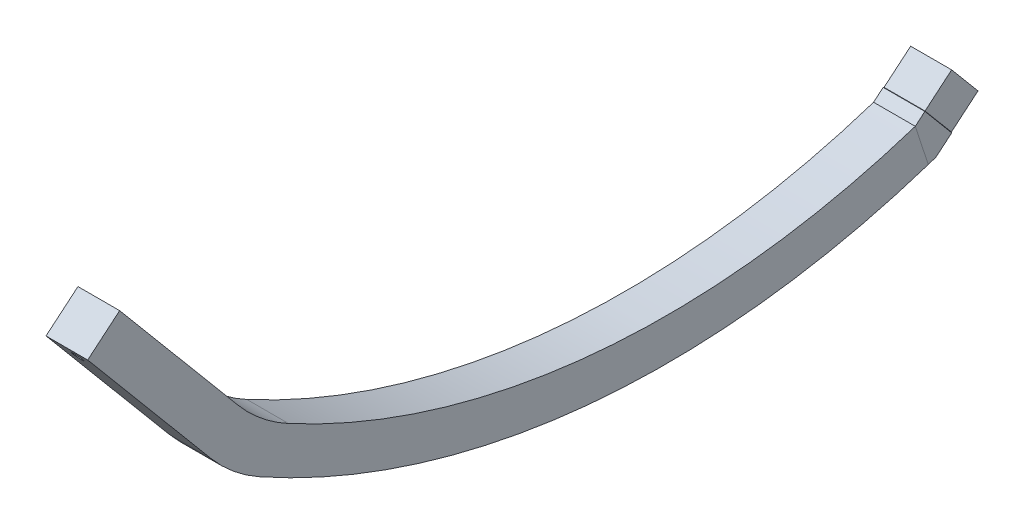
ISO-10303-21;
HEADER;
FILE_DESCRIPTION(('STEP AP214'),'2;1');
FILE_NAME('part.step','',(''),(''),'','','');
FILE_SCHEMA(('AUTOMOTIVE_DESIGN { 1 0 10303 214 1 1 1 1 }'));
ENDSEC;
DATA;
#1=APPLICATION_CONTEXT('core data for automotive mechanical design processes');
#2=APPLICATION_PROTOCOL_DEFINITION('international standard','automotive_design',2000,#1);
#3=PRODUCT_CONTEXT('',#1,'mechanical');
#4=PRODUCT('Part','Part','',(#3));
#5=PRODUCT_RELATED_PRODUCT_CATEGORY('part','',(#4));
#6=PRODUCT_DEFINITION_FORMATION('','',#4);
#7=PRODUCT_DEFINITION_CONTEXT('part definition',#1,'design');
#8=PRODUCT_DEFINITION('design','',#6,#7);
#9=PRODUCT_DEFINITION_SHAPE('','',#8);
#10=(LENGTH_UNIT() NAMED_UNIT(*) SI_UNIT(.MILLI.,.METRE.));
#11=(NAMED_UNIT(*) PLANE_ANGLE_UNIT() SI_UNIT($,.RADIAN.));
#12=(NAMED_UNIT(*) SI_UNIT($,.STERADIAN.) SOLID_ANGLE_UNIT());
#13=UNCERTAINTY_MEASURE_WITH_UNIT(LENGTH_MEASURE(1.E-05),#10,'distance_accuracy_value','');
#14=(GEOMETRIC_REPRESENTATION_CONTEXT(3) GLOBAL_UNCERTAINTY_ASSIGNED_CONTEXT((#13)) GLOBAL_UNIT_ASSIGNED_CONTEXT((#10,
#11,#12)) REPRESENTATION_CONTEXT('',''));
#15=CARTESIAN_POINT('',(0.,0.,0.));
#16=DIRECTION('',(0.,0.,1.));
#17=DIRECTION('',(1.,0.,0.));
#18=AXIS2_PLACEMENT_3D('',#15,#16,#17);
#19=CARTESIAN_POINT('',(12.,23.0257511275811,-14.4824825913771));
#20=DIRECTION('',(0.,0.766044443118982,0.642787609686534));
#21=DIRECTION('',(0.,-0.642787609686534,0.766044443118982));
#22=AXIS2_PLACEMENT_3D('',#19,#20,#21);
#23=PLANE('',#22);
#24=DIRECTION('',(0.,0.642787609686534,-0.766044443118982));
#25=VECTOR('',#24,1.);
#26=CARTESIAN_POINT('',(0.,23.0257511275811,-14.4824825913771));
#27=LINE('',#26,#25);
#28=CARTESIAN_POINT('',(0.,12.7411493725965,-2.22577150147341));
#29=VERTEX_POINT('',#28);
#30=CARTESIAN_POINT('',(0.,16.5335962697471,-6.7454337158754));
#31=VERTEX_POINT('',#30);
#32=EDGE_CURVE('E190',#29,#31,#27,.T.);
#33=ORIENTED_EDGE('',*,*,#32,.T.);
#34=DIRECTION('',(1.,0.,0.));
#35=VECTOR('',#34,1.);
#36=CARTESIAN_POINT('',(12.,16.5335962697471,-6.7454337158754));
#37=LINE('',#36,#35);
#38=CARTESIAN_POINT('',(12.,16.533596269747,-6.74543371587538));
#39=VERTEX_POINT('',#38);
#40=EDGE_CURVE('E69',#31,#39,#37,.T.);
#41=ORIENTED_EDGE('',*,*,#40,.T.);
#42=DIRECTION('',(0.,0.642787609686534,-0.766044443118982));
#43=VECTOR('',#42,1.);
#44=CARTESIAN_POINT('',(12.,23.0257511275811,-14.4824825913771));
#45=LINE('',#44,#43);
#46=CARTESIAN_POINT('',(12.,12.7411493725965,-2.22577150147341));
#47=VERTEX_POINT('',#46);
#48=EDGE_CURVE('E181',#47,#39,#45,.T.);
#49=ORIENTED_EDGE('',*,*,#48,.F.);
#50=DIRECTION('',(-1.,0.,0.));
#51=VECTOR('',#50,1.);
#52=CARTESIAN_POINT('',(12.,12.7411493725965,-2.22577150147341));
#53=LINE('',#52,#51);
#54=EDGE_CURVE('E195',#47,#29,#53,.T.);
#55=ORIENTED_EDGE('',*,*,#54,.T.);
#56=EDGE_LOOP('',(#33,#41,#49,#55));
#57=FACE_BOUND('',#56,.T.);
#58=ADVANCED_FACE('F45',(#57),#23,.F.);
#59=CARTESIAN_POINT('',(12.,23.403668611832,3.73581881138778));
#60=DIRECTION('',(0.,-0.766044443118981,-0.642787609686535));
#61=DIRECTION('',(0.,0.642787609686535,-0.766044443118982));
#62=AXIS2_PLACEMENT_3D('',#59,#60,#61);
#63=PLANE('',#62);
#64=DIRECTION('',(0.,-0.642787609686535,0.766044443118982));
#65=VECTOR('',#64,1.);
#66=CARTESIAN_POINT('',(12.,23.403668611832,3.73581881138778));
#67=LINE('',#66,#65);
#68=CARTESIAN_POINT('',(12.,25.7261295871748,0.968017600363012));
#69=VERTEX_POINT('',#68);
#70=CARTESIAN_POINT('',(12.,23.403668611832,3.73581881138778));
#71=VERTEX_POINT('',#70);
#72=EDGE_CURVE('E183',#69,#71,#67,.T.);
#73=ORIENTED_EDGE('',*,*,#72,.F.);
#74=DIRECTION('',(-1.,0.,0.));
#75=VECTOR('',#74,1.);
#76=CARTESIAN_POINT('',(0.,25.7261295871748,0.968017600363013));
#77=LINE('',#76,#75);
#78=CARTESIAN_POINT('',(0.,25.7261295871748,0.968017600363012));
#79=VERTEX_POINT('',#78);
#80=EDGE_CURVE('E12',#69,#79,#77,.T.);
#81=ORIENTED_EDGE('',*,*,#80,.T.);
#82=DIRECTION('',(0.,-0.642787609686535,0.766044443118982));
#83=VECTOR('',#82,1.);
#84=CARTESIAN_POINT('',(0.,23.403668611832,3.73581881138778));
#85=LINE('',#84,#83);
#86=CARTESIAN_POINT('',(0.,23.403668611832,3.73581881138778));
#87=VERTEX_POINT('',#86);
#88=EDGE_CURVE('E179',#79,#87,#85,.T.);
#89=ORIENTED_EDGE('',*,*,#88,.T.);
#90=DIRECTION('',(-1.,0.,0.));
#91=VECTOR('',#90,1.);
#92=CARTESIAN_POINT('',(12.,23.403668611832,3.73581881138778));
#93=LINE('',#92,#91);
#94=EDGE_CURVE('E185',#71,#87,#93,.T.);
#95=ORIENTED_EDGE('',*,*,#94,.F.);
#96=EDGE_LOOP('',(#73,#81,#89,#95));
#97=FACE_BOUND('',#96,.T.);
#98=ADVANCED_FACE('F213',(#97),#63,.F.);
#99=CARTESIAN_POINT('',(12.,241.476472406345,75.1760290102655));
#100=DIRECTION('',(1.,0.,0.));
#101=DIRECTION('',(0.,0.,-1.));
#102=AXIS2_PLACEMENT_3D('',#99,#100,#101);
#103=PLANE('',#102);
#104=ORIENTED_EDGE('',*,*,#48,.T.);
#105=DIRECTION('',(0.,0.766044443118981,0.642787609686535));
#106=VECTOR('',#105,1.);
#107=CARTESIAN_POINT('',(12.,188.873940413588,137.865285492186));
#108=LINE('',#107,#106);
#109=EDGE_CURVE('E54',#39,#69,#108,.T.);
#110=ORIENTED_EDGE('',*,*,#109,.T.);
#111=ORIENTED_EDGE('',*,*,#72,.T.);
#112=DIRECTION('',(0.,-0.950305717652662,-0.311318234282315));
#113=VECTOR('',#112,1.);
#114=CARTESIAN_POINT('',(12.,23.403668611832,3.73581881138778));
#115=LINE('',#114,#113);
#116=CARTESIAN_POINT('',(12.,12.,1.52655665885959E-13));
#117=VERTEX_POINT('',#116);
#118=EDGE_CURVE('E175',#71,#117,#115,.T.);
#119=ORIENTED_EDGE('',*,*,#118,.T.);
#120=CARTESIAN_POINT('',(12.,241.476472406345,75.1760290102655));
#121=DIRECTION('',(1.,0.,0.));
#122=DIRECTION('',(0.,0.,-1.));
#123=AXIS2_PLACEMENT_3D('',#120,#121,#122);
#124=CIRCLE('',#123,241.476472406345);
#125=EDGE_CURVE('E178',#117,#47,#124,.T.);
#126=ORIENTED_EDGE('',*,*,#125,.T.);
#127=EDGE_LOOP('',(#104,#110,#111,#119,#126));
#128=FACE_BOUND('',#127,.T.);
#129=ADVANCED_FACE('F223',(#128),#103,.T.);
#130=CARTESIAN_POINT('',(0.,241.476472406345,75.1760290102655));
#131=DIRECTION('',(1.,0.,0.));
#132=DIRECTION('',(0.,0.,-1.));
#133=AXIS2_PLACEMENT_3D('',#130,#131,#132);
#134=PLANE('',#133);
#135=ORIENTED_EDGE('',*,*,#88,.F.);
#136=DIRECTION('',(0.,-0.766044443118981,-0.642787609686535));
#137=VECTOR('',#136,1.);
#138=CARTESIAN_POINT('',(0.,16.5335962697471,-6.74543371587538));
#139=LINE('',#138,#137);
#140=EDGE_CURVE('E125',#79,#31,#139,.T.);
#141=ORIENTED_EDGE('',*,*,#140,.T.);
#142=ORIENTED_EDGE('',*,*,#32,.F.);
#143=CARTESIAN_POINT('',(0.,241.476472406345,75.1760290102655));
#144=DIRECTION('',(1.,0.,0.));
#145=DIRECTION('',(0.,0.,-1.));
#146=AXIS2_PLACEMENT_3D('',#143,#144,#145);
#147=CIRCLE('',#146,241.476472406345);
#148=CARTESIAN_POINT('',(0.,12.,1.52655665885959E-13));
#149=VERTEX_POINT('',#148);
#150=EDGE_CURVE('E188',#149,#29,#147,.T.);
#151=ORIENTED_EDGE('',*,*,#150,.F.);
#152=DIRECTION('',(0.,-0.950305717652662,-0.311318234282315));
#153=VECTOR('',#152,1.);
#154=CARTESIAN_POINT('',(0.,23.403668611832,3.73581881138778));
#155=LINE('',#154,#153);
#156=EDGE_CURVE('E171',#87,#149,#155,.T.);
#157=ORIENTED_EDGE('',*,*,#156,.F.);
#158=EDGE_LOOP('',(#135,#141,#142,#151,#157));
#159=FACE_BOUND('',#158,.T.);
#160=ADVANCED_FACE('F217',(#159),#134,.F.);
#161=CARTESIAN_POINT('',(12.,23.403668611832,3.73581881138778));
#162=DIRECTION('',(0.,0.311318234282315,-0.950305717652662));
#163=DIRECTION('',(0.,0.950305717652662,0.311318234282315));
#164=AXIS2_PLACEMENT_3D('',#161,#162,#163);
#165=PLANE('',#164);
#166=ORIENTED_EDGE('',*,*,#156,.T.);
#167=DIRECTION('',(-1.,0.,0.));
#168=VECTOR('',#167,1.);
#169=CARTESIAN_POINT('',(12.,12.,1.52655665885959E-13));
#170=LINE('',#169,#168);
#171=EDGE_CURVE('E198',#117,#149,#170,.T.);
#172=ORIENTED_EDGE('',*,*,#171,.F.);
#173=ORIENTED_EDGE('',*,*,#118,.F.);
#174=ORIENTED_EDGE('',*,*,#94,.T.);
#175=EDGE_LOOP('',(#166,#172,#173,#174));
#176=FACE_BOUND('',#175,.T.);
#177=ADVANCED_FACE('F221',(#176),#165,.F.);
#178=CARTESIAN_POINT('',(12.,241.476472406345,75.1760290102655));
#179=DIRECTION('',(-1.,0.,0.));
#180=DIRECTION('',(0.,0.,1.));
#181=AXIS2_PLACEMENT_3D('',#178,#179,#180);
#182=CYLINDRICAL_SURFACE('',#181,241.476472406345);
#183=ORIENTED_EDGE('',*,*,#150,.T.);
#184=ORIENTED_EDGE('',*,*,#54,.F.);
#185=ORIENTED_EDGE('',*,*,#125,.F.);
#186=ORIENTED_EDGE('',*,*,#171,.T.);
#187=EDGE_LOOP('',(#183,#184,#185,#186));
#188=FACE_BOUND('',#187,.T.);
#189=ADVANCED_FACE('F226',(#188),#182,.T.);
#190=CARTESIAN_POINT('',(0.1,16.6744794750276,-6.75775939921866));
#191=DIRECTION('',(-1.,0.,0.));
#192=DIRECTION('',(0.,0.,1.));
#193=AXIS2_PLACEMENT_3D('',#190,#191,#192);
#194=PLANE('',#193);
#195=DIRECTION('',(0.,0.766044443118982,0.642787609686535));
#196=VECTOR('',#195,1.);
#197=CARTESIAN_POINT('',(0.1,23.102355571893,-14.4182038304085));
#198=LINE('',#197,#196);
#199=CARTESIAN_POINT('',(0.1,23.102355571893,-14.4182038304085));
#200=VERTEX_POINT('',#199);
#201=CARTESIAN_POINT('',(0.1,32.141680000697,-6.83331003610735));
#202=VERTEX_POINT('',#201);
#203=EDGE_CURVE('E165',#200,#202,#198,.T.);
#204=ORIENTED_EDGE('',*,*,#203,.F.);
#205=DIRECTION('',(0.,0.642787609686535,-0.766044443118981));
#206=VECTOR('',#205,1.);
#207=CARTESIAN_POINT('',(0.1,16.6744794750276,-6.75775939921866));
#208=LINE('',#207,#206);
#209=CARTESIAN_POINT('',(0.1,16.6744794750276,-6.75775939921866));
#210=VERTEX_POINT('',#209);
#211=EDGE_CURVE('E154',#210,#200,#208,.T.);
#212=ORIENTED_EDGE('',*,*,#211,.F.);
#213=DIRECTION('',(0.,0.766044443118982,0.642787609686535));
#214=VECTOR('',#213,1.);
#215=CARTESIAN_POINT('',(0.1,16.6744794750276,-6.75775939921866));
#216=LINE('',#215,#214);
#217=CARTESIAN_POINT('',(0.1,25.7138039038316,0.827134395082459));
#218=VERTEX_POINT('',#217);
#219=EDGE_CURVE('E123',#210,#218,#216,.T.);
#220=ORIENTED_EDGE('',*,*,#219,.T.);
#221=DIRECTION('',(0.,0.642787609686535,-0.766044443118981));
#222=VECTOR('',#221,1.);
#223=CARTESIAN_POINT('',(0.1,25.7138039038316,0.827134395082459));
#224=LINE('',#223,#222);
#225=EDGE_CURVE('E143',#218,#202,#224,.T.);
#226=ORIENTED_EDGE('',*,*,#225,.T.);
#227=EDGE_LOOP('',(#204,#212,#220,#226));
#228=FACE_BOUND('',#227,.T.);
#229=ADVANCED_FACE('F153',(#228),#194,.T.);
#230=CARTESIAN_POINT('',(11.9,16.6744794750276,-6.75775939921866));
#231=DIRECTION('',(0.,-0.766044443118981,-0.642787609686535));
#232=DIRECTION('',(0.,0.642787609686535,-0.766044443118981));
#233=AXIS2_PLACEMENT_3D('',#230,#231,#232);
#234=PLANE('',#233);
#235=DIRECTION('',(-1.,0.,0.));
#236=VECTOR('',#235,1.);
#237=CARTESIAN_POINT('',(11.9,23.102355571893,-14.4182038304085));
#238=LINE('',#237,#236);
#239=CARTESIAN_POINT('',(11.9,23.102355571893,-14.4182038304085));
#240=VERTEX_POINT('',#239);
#241=EDGE_CURVE('E156',#240,#200,#238,.T.);
#242=ORIENTED_EDGE('',*,*,#241,.F.);
#243=DIRECTION('',(0.,0.642787609686535,-0.766044443118981));
#244=VECTOR('',#243,1.);
#245=CARTESIAN_POINT('',(11.9,16.6744794750276,-6.75775939921866));
#246=LINE('',#245,#244);
#247=CARTESIAN_POINT('',(11.9,16.6744794750276,-6.75775939921866));
#248=VERTEX_POINT('',#247);
#249=EDGE_CURVE('E172',#248,#240,#246,.T.);
#250=ORIENTED_EDGE('',*,*,#249,.F.);
#251=DIRECTION('',(-1.,0.,0.));
#252=VECTOR('',#251,1.);
#253=CARTESIAN_POINT('',(11.9,16.6744794750276,-6.75775939921866));
#254=LINE('',#253,#252);
#255=EDGE_CURVE('E151',#248,#210,#254,.T.);
#256=ORIENTED_EDGE('',*,*,#255,.T.);
#257=ORIENTED_EDGE('',*,*,#211,.T.);
#258=EDGE_LOOP('',(#242,#250,#256,#257));
#259=FACE_BOUND('',#258,.T.);
#260=ADVANCED_FACE('F258',(#259),#234,.T.);
#261=CARTESIAN_POINT('',(11.9,16.6744794750276,-6.75775939921866));
#262=DIRECTION('',(1.,0.,0.));
#263=DIRECTION('',(0.,0.,-1.));
#264=AXIS2_PLACEMENT_3D('',#261,#262,#263);
#265=PLANE('',#264);
#266=DIRECTION('',(0.,-0.766044443118982,-0.642787609686535));
#267=VECTOR('',#266,1.);
#268=CARTESIAN_POINT('',(11.9,23.102355571893,-14.4182038304085));
#269=LINE('',#268,#267);
#270=CARTESIAN_POINT('',(11.9,32.141680000697,-6.83331003610735));
#271=VERTEX_POINT('',#270);
#272=EDGE_CURVE('E159',#271,#240,#269,.T.);
#273=ORIENTED_EDGE('',*,*,#272,.F.);
#274=DIRECTION('',(0.,0.642787609686535,-0.766044443118981));
#275=VECTOR('',#274,1.);
#276=CARTESIAN_POINT('',(11.9,25.7138039038316,0.827134395082459));
#277=LINE('',#276,#275);
#278=CARTESIAN_POINT('',(11.9,25.7138039038316,0.82713439508246));
#279=VERTEX_POINT('',#278);
#280=EDGE_CURVE('E150',#279,#271,#277,.T.);
#281=ORIENTED_EDGE('',*,*,#280,.F.);
#282=DIRECTION('',(0.,-0.766044443118982,-0.642787609686535));
#283=VECTOR('',#282,1.);
#284=CARTESIAN_POINT('',(11.9,16.6744794750276,-6.75775939921866));
#285=LINE('',#284,#283);
#286=EDGE_CURVE('E140',#279,#248,#285,.T.);
#287=ORIENTED_EDGE('',*,*,#286,.T.);
#288=ORIENTED_EDGE('',*,*,#249,.T.);
#289=EDGE_LOOP('',(#273,#281,#287,#288));
#290=FACE_BOUND('',#289,.T.);
#291=ADVANCED_FACE('F254',(#290),#265,.T.);
#292=CARTESIAN_POINT('',(11.9,25.7138039038316,0.827134395082459));
#293=DIRECTION('',(0.,0.766044443118981,0.642787609686535));
#294=DIRECTION('',(0.,-0.642787609686535,0.766044443118981));
#295=AXIS2_PLACEMENT_3D('',#292,#293,#294);
#296=PLANE('',#295);
#297=DIRECTION('',(1.,0.,0.));
#298=VECTOR('',#297,1.);
#299=CARTESIAN_POINT('',(11.9,32.141680000697,-6.83331003610736));
#300=LINE('',#299,#298);
#301=EDGE_CURVE('E146',#202,#271,#300,.T.);
#302=ORIENTED_EDGE('',*,*,#301,.F.);
#303=ORIENTED_EDGE('',*,*,#225,.F.);
#304=DIRECTION('',(1.,0.,0.));
#305=VECTOR('',#304,1.);
#306=CARTESIAN_POINT('',(11.9,25.7138039038316,0.827134395082459));
#307=LINE('',#306,#305);
#308=EDGE_CURVE('E132',#218,#279,#307,.T.);
#309=ORIENTED_EDGE('',*,*,#308,.T.);
#310=ORIENTED_EDGE('',*,*,#280,.T.);
#311=EDGE_LOOP('',(#302,#303,#309,#310));
#312=FACE_BOUND('',#311,.T.);
#313=ADVANCED_FACE('F144',(#312),#296,.T.);
#314=CARTESIAN_POINT('',(12.,32.2182844450088,-6.7690312751387));
#315=DIRECTION('',(0.,-0.642787609686535,0.766044443118981));
#316=DIRECTION('',(0.,-0.766044443118981,-0.642787609686535));
#317=AXIS2_PLACEMENT_3D('',#314,#315,#316);
#318=PLANE('',#317);
#319=ORIENTED_EDGE('',*,*,#203,.T.);
#320=ORIENTED_EDGE('',*,*,#301,.T.);
#321=ORIENTED_EDGE('',*,*,#272,.T.);
#322=ORIENTED_EDGE('',*,*,#241,.T.);
#323=EDGE_LOOP('',(#319,#320,#321,#322));
#324=FACE_BOUND('',#323,.T.);
#325=ADVANCED_FACE('F235',(#324),#318,.F.);
#326=CARTESIAN_POINT('',(12.,188.873940413588,137.865285492186));
#327=DIRECTION('',(-0.707106781186633,-0.454519477671986,0.541675220419639));
#328=DIRECTION('',(0.,0.766044443118981,0.642787609686535));
#329=AXIS2_PLACEMENT_3D('',#326,#327,#328);
#330=PLANE('',#329);
#331=DIRECTION('',(0.577350269189527,0.0711623659617004,0.813389564930307));
#332=VECTOR('',#331,1.);
#333=CARTESIAN_POINT('',(9.93333333333398,25.4713987980811,-1.94356864210147));
#334=LINE('',#333,#332);
#335=EDGE_CURVE('E136',#69,#279,#334,.F.);
#336=ORIENTED_EDGE('',*,*,#335,.F.);
#337=ORIENTED_EDGE('',*,*,#109,.F.);
#338=DIRECTION('',(0.577350269189526,-0.81338956493031,0.0711623659616761));
#339=VECTOR('',#338,1.);
#340=CARTESIAN_POINT('',(-62.9914471637958,122.183950720401,-15.9886420278021));
#341=LINE('',#340,#339);
#342=EDGE_CURVE('E49',#248,#39,#341,.T.);
#343=ORIENTED_EDGE('',*,*,#342,.F.);
#344=ORIENTED_EDGE('',*,*,#286,.F.);
#345=EDGE_LOOP('',(#336,#337,#343,#344));
#346=FACE_BOUND('',#345,.T.);
#347=ADVANCED_FACE('F47',(#346),#330,.F.);
#348=CARTESIAN_POINT('',(6.,16.6744794750276,-6.75775939921864));
#349=DIRECTION('',(0.,-0.0871557427476467,-0.996194698091746));
#350=DIRECTION('',(1.,0.,0.));
#351=AXIS2_PLACEMENT_3D('',#348,#349,#350);
#352=PLANE('',#351);
#353=ORIENTED_EDGE('',*,*,#342,.T.);
#354=ORIENTED_EDGE('',*,*,#40,.F.);
#355=DIRECTION('',(0.577350269189529,0.813389564930307,-0.0711623659616759));
#356=VECTOR('',#355,1.);
#357=CARTESIAN_POINT('',(2.06666666666601,19.4451825122116,-7.00016450496905));
#358=LINE('',#357,#356);
#359=EDGE_CURVE('E128',#210,#31,#358,.F.);
#360=ORIENTED_EDGE('',*,*,#359,.F.);
#361=ORIENTED_EDGE('',*,*,#255,.F.);
#362=EDGE_LOOP('',(#353,#354,#360,#361));
#363=FACE_BOUND('',#362,.T.);
#364=ADVANCED_FACE('F208',(#363),#352,.T.);
#365=CARTESIAN_POINT('',(6.,25.7138039038316,0.827134395082455));
#366=DIRECTION('',(0.,0.996194698091744,-0.0871557427476766));
#367=DIRECTION('',(-1.,0.,0.));
#368=AXIS2_PLACEMENT_3D('',#365,#366,#367);
#369=PLANE('',#368);
#370=ORIENTED_EDGE('',*,*,#335,.T.);
#371=ORIENTED_EDGE('',*,*,#308,.F.);
#372=DIRECTION('',(-0.57735026918953,0.0711623659617003,0.813389564930304));
#373=VECTOR('',#372,1.);
#374=CARTESIAN_POINT('',(2.06666666666602,25.4713987980811,-1.94356864210149));
#375=LINE('',#374,#373);
#376=EDGE_CURVE('E119',#79,#218,#375,.F.);
#377=ORIENTED_EDGE('',*,*,#376,.F.);
#378=ORIENTED_EDGE('',*,*,#80,.F.);
#379=EDGE_LOOP('',(#370,#371,#377,#378));
#380=FACE_BOUND('',#379,.T.);
#381=ADVANCED_FACE('F134',(#380),#369,.T.);
#382=CARTESIAN_POINT('',(0.100000000000007,21.1941416894296,-2.9653125020681));
#383=DIRECTION('',(-0.70710678118663,0.454519477671988,-0.541675220419641));
#384=DIRECTION('',(0.,-0.766044443118981,-0.642787609686535));
#385=AXIS2_PLACEMENT_3D('',#382,#383,#384);
#386=PLANE('',#385);
#387=ORIENTED_EDGE('',*,*,#359,.T.);
#388=ORIENTED_EDGE('',*,*,#140,.F.);
#389=ORIENTED_EDGE('',*,*,#376,.T.);
#390=ORIENTED_EDGE('',*,*,#219,.F.);
#391=EDGE_LOOP('',(#387,#388,#389,#390));
#392=FACE_BOUND('',#391,.T.);
#393=ADVANCED_FACE('F121',(#392),#386,.T.);
#394=CLOSED_SHELL('',(#58,#98,#129,#160,#177,#189,#229,#260,#291,#313,#325,#347,#364,#381,#393));
#395=MANIFOLD_SOLID_BREP('B2',#394);
#396=CARTESIAN_POINT('',(12.,241.476472406345,75.1760290102655));
#397=DIRECTION('',(-1.,0.,0.));
#398=DIRECTION('',(0.,0.,1.));
#399=AXIS2_PLACEMENT_3D('',#396,#397,#398);
#400=CYLINDRICAL_SURFACE('',#399,241.476472406345);
#401=CARTESIAN_POINT('',(12.,241.476472406345,75.1760290102655));
#402=DIRECTION('',(1.,0.,0.));
#403=DIRECTION('',(0.,0.,1.));
#404=AXIS2_PLACEMENT_3D('',#401,#402,#403);
#405=CIRCLE('',#404,241.476472406345);
#406=CARTESIAN_POINT('',(12.,30.3736096091177,192.421361730282));
#407=VERTEX_POINT('',#406);
#408=CARTESIAN_POINT('',(12.,12.,0.));
#409=VERTEX_POINT('',#408);
#410=EDGE_CURVE('E450',#407,#409,#405,.T.);
#411=ORIENTED_EDGE('',*,*,#410,.F.);
#412=DIRECTION('',(-1.,0.,0.));
#413=VECTOR('',#412,1.);
#414=CARTESIAN_POINT('',(12.,30.3736096091177,192.421361730282));
#415=LINE('',#414,#413);
#416=CARTESIAN_POINT('',(0.,30.3736096091177,192.421361730282));
#417=VERTEX_POINT('',#416);
#418=EDGE_CURVE('E471',#407,#417,#415,.T.);
#419=ORIENTED_EDGE('',*,*,#418,.T.);
#420=CARTESIAN_POINT('',(0.,241.476472406345,75.1760290102655));
#421=DIRECTION('',(1.,0.,0.));
#422=DIRECTION('',(0.,0.,1.));
#423=AXIS2_PLACEMENT_3D('',#420,#421,#422);
#424=CIRCLE('',#423,241.476472406345);
#425=CARTESIAN_POINT('',(0.,12.,0.));
#426=VERTEX_POINT('',#425);
#427=EDGE_CURVE('E449',#417,#426,#424,.T.);
#428=ORIENTED_EDGE('',*,*,#427,.T.);
#429=DIRECTION('',(-1.,0.,0.));
#430=VECTOR('',#429,1.);
#431=CARTESIAN_POINT('',(12.,12.,0.));
#432=LINE('',#431,#430);
#433=EDGE_CURVE('E465',#409,#426,#432,.T.);
#434=ORIENTED_EDGE('',*,*,#433,.F.);
#435=EDGE_LOOP('',(#411,#419,#428,#434));
#436=FACE_BOUND('',#435,.T.);
#437=ADVANCED_FACE('F355',(#436),#400,.T.);
#438=CARTESIAN_POINT('',(12.,12.,0.));
#439=DIRECTION('',(0.,-0.311318234282315,0.950305717652662));
#440=DIRECTION('',(0.,-0.950305717652662,-0.311318234282315));
#441=AXIS2_PLACEMENT_3D('',#438,#439,#440);
#442=PLANE('',#441);
#443=DIRECTION('',(0.,0.950305717652662,0.311318234282315));
#444=VECTOR('',#443,1.);
#445=CARTESIAN_POINT('',(0.,12.,0.));
#446=LINE('',#445,#444);
#447=CARTESIAN_POINT('',(0.,23.403668611832,3.73581881138778));
#448=VERTEX_POINT('',#447);
#449=EDGE_CURVE('E459',#426,#448,#446,.T.);
#450=ORIENTED_EDGE('',*,*,#449,.T.);
#451=DIRECTION('',(-1.,0.,0.));
#452=VECTOR('',#451,1.);
#453=CARTESIAN_POINT('',(12.,23.403668611832,3.73581881138778));
#454=LINE('',#453,#452);
#455=CARTESIAN_POINT('',(12.,23.403668611832,3.73581881138778));
#456=VERTEX_POINT('',#455);
#457=EDGE_CURVE('E457',#456,#448,#454,.T.);
#458=ORIENTED_EDGE('',*,*,#457,.F.);
#459=DIRECTION('',(0.,0.950305717652662,0.311318234282315));
#460=VECTOR('',#459,1.);
#461=CARTESIAN_POINT('',(12.,12.,0.));
#462=LINE('',#461,#460);
#463=EDGE_CURVE('E452',#409,#456,#462,.T.);
#464=ORIENTED_EDGE('',*,*,#463,.F.);
#465=ORIENTED_EDGE('',*,*,#433,.T.);
#466=EDGE_LOOP('',(#450,#458,#464,#465));
#467=FACE_BOUND('',#466,.T.);
#468=ADVANCED_FACE('F497',(#467),#442,.F.);
#469=CARTESIAN_POINT('',(12.,241.476472406345,75.1760290102655));
#470=DIRECTION('',(-1.,0.,0.));
#471=DIRECTION('',(0.,0.,1.));
#472=AXIS2_PLACEMENT_3D('',#469,#470,#471);
#473=CYLINDRICAL_SURFACE('',#472,229.476472406345);
#474=CARTESIAN_POINT('',(0.,241.476472406345,75.1760290102655));
#475=DIRECTION('',(-1.,0.,0.));
#476=DIRECTION('',(0.,0.,1.));
#477=AXIS2_PLACEMENT_3D('',#474,#475,#476);
#478=CIRCLE('',#477,229.476472406345);
#479=CARTESIAN_POINT('',(0.,39.5231160556017,184.145259744128));
#480=VERTEX_POINT('',#479);
#481=EDGE_CURVE('E453',#448,#480,#478,.T.);
#482=ORIENTED_EDGE('',*,*,#481,.T.);
#483=DIRECTION('',(-1.,0.,0.));
#484=VECTOR('',#483,1.);
#485=CARTESIAN_POINT('',(12.,39.5231160556017,184.145259744128));
#486=LINE('',#485,#484);
#487=CARTESIAN_POINT('',(12.,39.5231160556017,184.145259744128));
#488=VERTEX_POINT('',#487);
#489=EDGE_CURVE('E480',#480,#488,#486,.F.);
#490=ORIENTED_EDGE('',*,*,#489,.T.);
#491=CARTESIAN_POINT('',(12.,241.476472406345,75.1760290102655));
#492=DIRECTION('',(-1.,0.,0.));
#493=DIRECTION('',(0.,0.,1.));
#494=AXIS2_PLACEMENT_3D('',#491,#492,#493);
#495=CIRCLE('',#494,229.476472406345);
#496=EDGE_CURVE('E455',#456,#488,#495,.T.);
#497=ORIENTED_EDGE('',*,*,#496,.F.);
#498=ORIENTED_EDGE('',*,*,#457,.T.);
#499=EDGE_LOOP('',(#482,#490,#497,#498));
#500=FACE_BOUND('',#499,.T.);
#501=ADVANCED_FACE('F491',(#500),#473,.F.);
#502=CARTESIAN_POINT('',(12.,241.476472406345,75.1760290102655));
#503=DIRECTION('',(-1.,0.,0.));
#504=DIRECTION('',(0.,0.,1.));
#505=AXIS2_PLACEMENT_3D('',#502,#503,#504);
#506=PLANE('',#505);
#507=DIRECTION('',(0.,0.766044443118982,0.642787609686535));
#508=VECTOR('',#507,1.);
#509=CARTESIAN_POINT('',(12.,71.9959787813234,231.662517153645));
#510=LINE('',#509,#508);
#511=CARTESIAN_POINT('',(12.,41.9450844088605,206.446822769164));
#512=VERTEX_POINT('',#511);
#513=CARTESIAN_POINT('',(12.,84.2526898712272,241.947118908629));
#514=VERTEX_POINT('',#513);
#515=EDGE_CURVE('E425',#512,#514,#510,.T.);
#516=ORIENTED_EDGE('',*,*,#515,.F.);
#517=CARTESIAN_POINT('',(12.,74.0844648931873,168.144600613215));
#518=DIRECTION('',(-1.,0.,0.));
#519=DIRECTION('',(0.,0.,1.));
#520=AXIS2_PLACEMENT_3D('',#517,#518,#519);
#521=CIRCLE('',#520,50.);
#522=EDGE_CURVE('E478',#512,#407,#521,.F.);
#523=ORIENTED_EDGE('',*,*,#522,.T.);
#524=ORIENTED_EDGE('',*,*,#410,.T.);
#525=ORIENTED_EDGE('',*,*,#463,.T.);
#526=ORIENTED_EDGE('',*,*,#496,.T.);
#527=CARTESIAN_POINT('',(12.,83.5261796884465,160.402252543611));
#528=DIRECTION('',(-1.,0.,0.));
#529=DIRECTION('',(0.,0.,1.));
#530=AXIS2_PLACEMENT_3D('',#527,#528,#529);
#531=CIRCLE('',#530,50.);
#532=CARTESIAN_POINT('',(12.,51.3867992041199,198.70447469956));
#533=VERTEX_POINT('',#532);
#534=EDGE_CURVE('E364',#488,#533,#531,.T.);
#535=ORIENTED_EDGE('',*,*,#534,.T.);
#536=DIRECTION('',(0.,0.766044443118982,0.642787609686534));
#537=VECTOR('',#536,1.);
#538=CARTESIAN_POINT('',(12.,79.7094300975618,222.469983836217));
#539=LINE('',#538,#537);
#540=CARTESIAN_POINT('',(12.,91.9661411874656,232.754585591202));
#541=VERTEX_POINT('',#540);
#542=EDGE_CURVE('E417',#533,#541,#539,.T.);
#543=ORIENTED_EDGE('',*,*,#542,.T.);
#544=DIRECTION('',(0.,0.642787609686532,-0.766044443118984));
#545=VECTOR('',#544,1.);
#546=CARTESIAN_POINT('',(12.,84.2526898712272,241.947118908629));
#547=LINE('',#546,#545);
#548=EDGE_CURVE('E422',#514,#541,#547,.T.);
#549=ORIENTED_EDGE('',*,*,#548,.F.);
#550=EDGE_LOOP('',(#516,#523,#524,#525,#526,#535,#543,#549));
#551=FACE_BOUND('',#550,.T.);
#552=ADVANCED_FACE('F420',(#551),#506,.F.);
#553=CARTESIAN_POINT('',(0.,241.476472406345,75.1760290102655));
#554=DIRECTION('',(-1.,0.,0.));
#555=DIRECTION('',(0.,0.,1.));
#556=AXIS2_PLACEMENT_3D('',#553,#554,#555);
#557=PLANE('',#556);
#558=ORIENTED_EDGE('',*,*,#427,.F.);
#559=CARTESIAN_POINT('',(0.,74.0844648931873,168.144600613215));
#560=DIRECTION('',(-1.,0.,0.));
#561=DIRECTION('',(0.,0.,1.));
#562=AXIS2_PLACEMENT_3D('',#559,#560,#561);
#563=CIRCLE('',#562,50.);
#564=CARTESIAN_POINT('',(0.,41.9450844088605,206.446822769164));
#565=VERTEX_POINT('',#564);
#566=EDGE_CURVE('E474',#417,#565,#563,.T.);
#567=ORIENTED_EDGE('',*,*,#566,.T.);
#568=DIRECTION('',(0.,-0.766044443118982,-0.642787609686535));
#569=VECTOR('',#568,1.);
#570=CARTESIAN_POINT('',(0.,94.3966616452473,250.458921882882));
#571=LINE('',#570,#569);
#572=CARTESIAN_POINT('',(0.,84.2526898712272,241.947118908629));
#573=VERTEX_POINT('',#572);
#574=EDGE_CURVE('E468',#573,#565,#571,.T.);
#575=ORIENTED_EDGE('',*,*,#574,.F.);
#576=DIRECTION('',(0.,-0.642787609686532,0.766044443118984));
#577=VECTOR('',#576,1.);
#578=CARTESIAN_POINT('',(0.,84.2526898712272,241.947118908629));
#579=LINE('',#578,#577);
#580=CARTESIAN_POINT('',(0.,91.9661411874656,232.754585591202));
#581=VERTEX_POINT('',#580);
#582=EDGE_CURVE('E434',#581,#573,#579,.T.);
#583=ORIENTED_EDGE('',*,*,#582,.F.);
#584=DIRECTION('',(0.,0.766044443118982,0.642787609686534));
#585=VECTOR('',#584,1.);
#586=CARTESIAN_POINT('',(0.,79.7094300975618,222.469983836217));
#587=LINE('',#586,#585);
#588=CARTESIAN_POINT('',(0.,51.3867992041198,198.70447469956));
#589=VERTEX_POINT('',#588);
#590=EDGE_CURVE('E424',#589,#581,#587,.T.);
#591=ORIENTED_EDGE('',*,*,#590,.F.);
#592=CARTESIAN_POINT('',(0.,83.5261796884465,160.402252543611));
#593=DIRECTION('',(-1.,0.,0.));
#594=DIRECTION('',(0.,0.,1.));
#595=AXIS2_PLACEMENT_3D('',#592,#593,#594);
#596=CIRCLE('',#595,50.);
#597=EDGE_CURVE('E43',#589,#480,#596,.F.);
#598=ORIENTED_EDGE('',*,*,#597,.T.);
#599=ORIENTED_EDGE('',*,*,#481,.F.);
#600=ORIENTED_EDGE('',*,*,#449,.F.);
#601=EDGE_LOOP('',(#558,#567,#575,#583,#591,#598,#599,#600));
#602=FACE_BOUND('',#601,.T.);
#603=ADVANCED_FACE('F487',(#602),#557,.T.);
#604=CARTESIAN_POINT('',(-52.3125128274926,79.7094300975618,222.469983836217));
#605=DIRECTION('',(0.,0.642787609686534,-0.766044443118982));
#606=DIRECTION('',(0.,0.766044443118982,0.642787609686534));
#607=AXIS2_PLACEMENT_3D('',#604,#605,#606);
#608=PLANE('',#607);
#609=CARTESIAN_POINT('',(6.,88.1359189718709,229.540647542769));
#610=DIRECTION('',(0.,0.642787609686533,-0.766044443118984));
#611=DIRECTION('',(0.,0.766044443118984,0.642787609686533));
#612=AXIS2_PLACEMENT_3D('',#609,#610,#611);
#613=CIRCLE('',#612,1.54999999999999);
#614=CARTESIAN_POINT('',(6.,89.3232878587053,230.536968337783));
#615=VERTEX_POINT('',#614);
#616=EDGE_CURVE('E442',#615,#615,#613,.T.);
#617=ORIENTED_EDGE('',*,*,#616,.F.);
#618=EDGE_LOOP('',(#617));
#619=FACE_BOUND('',#618,.T.);
#620=ORIENTED_EDGE('',*,*,#542,.F.);
#621=DIRECTION('',(-1.,0.,0.));
#622=VECTOR('',#621,1.);
#623=CARTESIAN_POINT('',(-52.3125128274926,51.3867992041198,198.70447469956));
#624=LINE('',#623,#622);
#625=EDGE_CURVE('E482',#533,#589,#624,.T.);
#626=ORIENTED_EDGE('',*,*,#625,.T.);
#627=ORIENTED_EDGE('',*,*,#590,.T.);
#628=DIRECTION('',(-1.,0.,0.));
#629=VECTOR('',#628,1.);
#630=CARTESIAN_POINT('',(0.,91.9661411874656,232.754585591202));
#631=LINE('',#630,#629);
#632=EDGE_CURVE('E428',#541,#581,#631,.T.);
#633=ORIENTED_EDGE('',*,*,#632,.F.);
#634=EDGE_LOOP('',(#620,#626,#627,#633));
#635=FACE_BOUND('',#634,.T.);
#636=ADVANCED_FACE('F429',(#619,#635),#608,.T.);
#637=CARTESIAN_POINT('',(0.,71.9959787813234,231.662517153645));
#638=DIRECTION('',(0.,0.642787609686535,-0.766044443118982));
#639=DIRECTION('',(0.,0.766044443118982,0.642787609686535));
#640=AXIS2_PLACEMENT_3D('',#637,#638,#639);
#641=PLANE('',#640);
#642=CARTESIAN_POINT('',(6.,80.4224676556322,238.733180860197));
#643=DIRECTION('',(0.,0.642787609686535,-0.766044443118982));
#644=DIRECTION('',(0.,0.766044443118982,0.642787609686535));
#645=AXIS2_PLACEMENT_3D('',#642,#643,#644);
#646=CIRCLE('',#645,1.54999999999999);
#647=CARTESIAN_POINT('',(6.,81.6098365424667,239.729501655211));
#648=VERTEX_POINT('',#647);
#649=EDGE_CURVE('E359',#648,#648,#646,.T.);
#650=ORIENTED_EDGE('',*,*,#649,.T.);
#651=EDGE_LOOP('',(#650));
#652=FACE_BOUND('',#651,.T.);
#653=ORIENTED_EDGE('',*,*,#574,.T.);
#654=DIRECTION('',(-1.,0.,0.));
#655=VECTOR('',#654,1.);
#656=CARTESIAN_POINT('',(0.,41.9450844088605,206.446822769164));
#657=LINE('',#656,#655);
#658=EDGE_CURVE('E476',#565,#512,#657,.F.);
#659=ORIENTED_EDGE('',*,*,#658,.T.);
#660=ORIENTED_EDGE('',*,*,#515,.T.);
#661=DIRECTION('',(1.,0.,0.));
#662=VECTOR('',#661,1.);
#663=CARTESIAN_POINT('',(0.,84.2526898712272,241.947118908629));
#664=LINE('',#663,#662);
#665=EDGE_CURVE('E439',#573,#514,#664,.T.);
#666=ORIENTED_EDGE('',*,*,#665,.F.);
#667=EDGE_LOOP('',(#653,#659,#660,#666));
#668=FACE_BOUND('',#667,.T.);
#669=ADVANCED_FACE('F506',(#652,#668),#641,.F.);
#670=CARTESIAN_POINT('',(12.,74.0844648931873,168.144600613215));
#671=DIRECTION('',(-1.,0.,0.));
#672=DIRECTION('',(0.,0.,1.));
#673=AXIS2_PLACEMENT_3D('',#670,#671,#672);
#674=CYLINDRICAL_SURFACE('',#673,50.);
#675=ORIENTED_EDGE('',*,*,#522,.F.);
#676=ORIENTED_EDGE('',*,*,#658,.F.);
#677=ORIENTED_EDGE('',*,*,#566,.F.);
#678=ORIENTED_EDGE('',*,*,#418,.F.);
#679=EDGE_LOOP('',(#675,#676,#677,#678));
#680=FACE_BOUND('',#679,.T.);
#681=ADVANCED_FACE('F503',(#680),#674,.T.);
#682=CARTESIAN_POINT('',(12.,83.5261796884465,160.402252543611));
#683=DIRECTION('',(-1.,0.,0.));
#684=DIRECTION('',(0.,0.,1.));
#685=AXIS2_PLACEMENT_3D('',#682,#683,#684);
#686=CYLINDRICAL_SURFACE('',#685,50.);
#687=ORIENTED_EDGE('',*,*,#597,.F.);
#688=ORIENTED_EDGE('',*,*,#625,.F.);
#689=ORIENTED_EDGE('',*,*,#534,.F.);
#690=ORIENTED_EDGE('',*,*,#489,.F.);
#691=EDGE_LOOP('',(#687,#688,#689,#690));
#692=FACE_BOUND('',#691,.T.);
#693=ADVANCED_FACE('F357',(#692),#686,.F.);
#694=CARTESIAN_POINT('',(0.,168.577207225544,141.453072407847));
#695=DIRECTION('',(0.,-0.766044443118984,-0.642787609686532));
#696=DIRECTION('',(0.,0.642787609686532,-0.766044443118984));
#697=AXIS2_PLACEMENT_3D('',#694,#695,#696);
#698=PLANE('',#697);
#699=ORIENTED_EDGE('',*,*,#548,.T.);
#700=ORIENTED_EDGE('',*,*,#632,.T.);
#701=ORIENTED_EDGE('',*,*,#582,.T.);
#702=ORIENTED_EDGE('',*,*,#665,.T.);
#703=EDGE_LOOP('',(#699,#700,#701,#702));
#704=FACE_BOUND('',#703,.T.);
#705=ADVANCED_FACE('F437',(#704),#698,.F.);
#706=CARTESIAN_POINT('',(6.,45.6112857498572,280.219531958855));
#707=DIRECTION('',(0.,0.642787609686533,-0.766044443118984));
#708=DIRECTION('',(0.,0.766044443118984,0.642787609686533));
#709=AXIS2_PLACEMENT_3D('',#706,#707,#708);
#710=CYLINDRICAL_SURFACE('',#709,1.54999999999999);
#711=ORIENTED_EDGE('',*,*,#616,.T.);
#712=EDGE_LOOP('',(#711));
#713=FACE_BOUND('',#712,.T.);
#714=ORIENTED_EDGE('',*,*,#649,.F.);
#715=EDGE_LOOP('',(#714));
#716=FACE_BOUND('',#715,.T.);
#717=ADVANCED_FACE('F557',(#713,#716),#710,.F.);
#718=CLOSED_SHELL('',(#437,#468,#501,#552,#603,#636,#669,#681,#693,#705,#717));
#719=MANIFOLD_SOLID_BREP('B6',#718);
#720=ADVANCED_BREP_SHAPE_REPRESENTATION('',(#18,#395,#719),#14);
#721=SHAPE_DEFINITION_REPRESENTATION(#9,#720);
ENDSEC;
END-ISO-10303-21;
